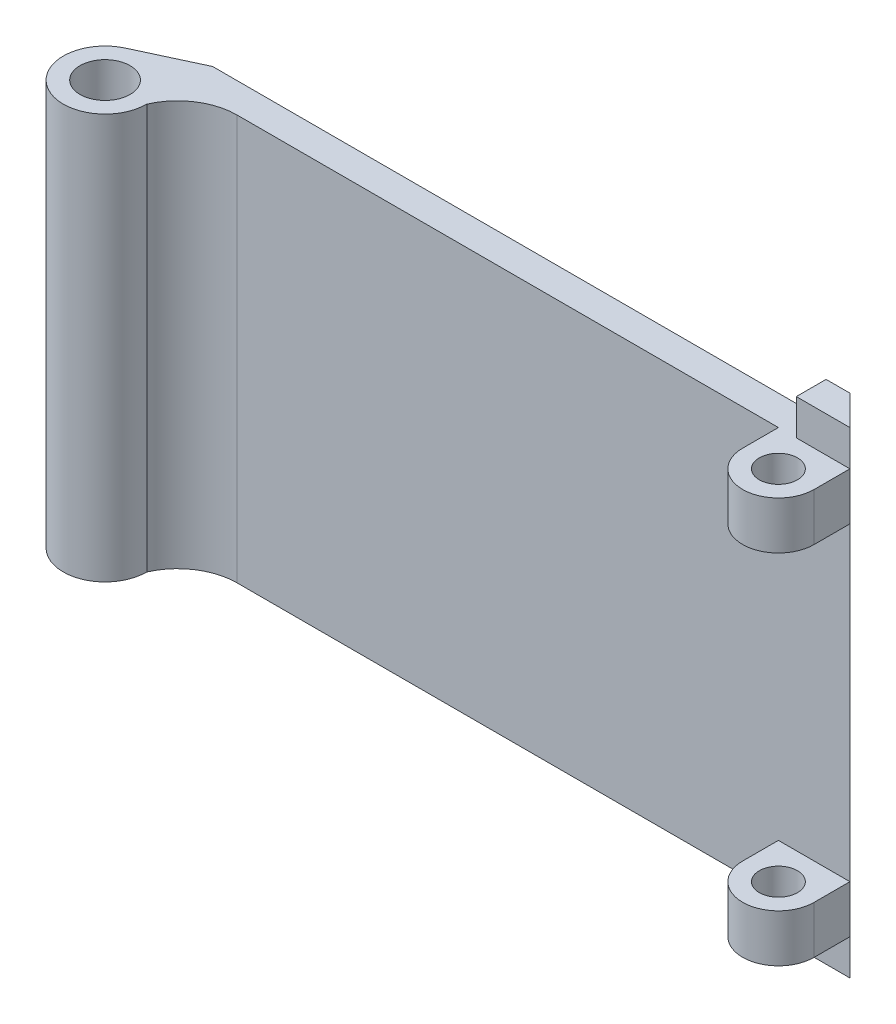
ISO-10303-21;
HEADER;
FILE_DESCRIPTION(('STEP AP214'),'2;1');
FILE_NAME('part.step','',(''),(''),'','','');
FILE_SCHEMA(('AUTOMOTIVE_DESIGN { 1 0 10303 214 1 1 1 1 }'));
ENDSEC;
DATA;
#1=APPLICATION_CONTEXT('core data for automotive mechanical design processes');
#2=APPLICATION_PROTOCOL_DEFINITION('international standard','automotive_design',2000,#1);
#3=PRODUCT_CONTEXT('',#1,'mechanical');
#4=PRODUCT('Part','Part','',(#3));
#5=PRODUCT_RELATED_PRODUCT_CATEGORY('part','',(#4));
#6=PRODUCT_DEFINITION_FORMATION('','',#4);
#7=PRODUCT_DEFINITION_CONTEXT('part definition',#1,'design');
#8=PRODUCT_DEFINITION('design','',#6,#7);
#9=PRODUCT_DEFINITION_SHAPE('','',#8);
#10=(LENGTH_UNIT() NAMED_UNIT(*) SI_UNIT(.MILLI.,.METRE.));
#11=(NAMED_UNIT(*) PLANE_ANGLE_UNIT() SI_UNIT($,.RADIAN.));
#12=(NAMED_UNIT(*) SI_UNIT($,.STERADIAN.) SOLID_ANGLE_UNIT());
#13=UNCERTAINTY_MEASURE_WITH_UNIT(LENGTH_MEASURE(1.E-05),#10,'distance_accuracy_value','');
#14=(GEOMETRIC_REPRESENTATION_CONTEXT(3) GLOBAL_UNCERTAINTY_ASSIGNED_CONTEXT((#13)) GLOBAL_UNIT_ASSIGNED_CONTEXT((#10,
#11,#12)) REPRESENTATION_CONTEXT('',''));
#15=CARTESIAN_POINT('',(0.,0.,0.));
#16=DIRECTION('',(0.,0.,1.));
#17=DIRECTION('',(1.,0.,0.));
#18=AXIS2_PLACEMENT_3D('',#15,#16,#17);
#19=CARTESIAN_POINT('',(0.,0.,2.5));
#20=DIRECTION('',(0.,1.,0.));
#21=DIRECTION('',(-1.,0.,0.));
#22=AXIS2_PLACEMENT_3D('',#19,#20,#21);
#23=PLANE('',#22);
#24=DIRECTION('',(0.906734440104032,0.,-0.421702092867972));
#25=VECTOR('',#24,1.);
#26=CARTESIAN_POINT('',(1.16058560122015,0.,2.49546528962715));
#27=LINE('',#26,#25);
#28=CARTESIAN_POINT('',(1.5240426749621,0.,2.32642945963589));
#29=VERTEX_POINT('',#28);
#30=CARTESIAN_POINT('',(6.52627944162882,0.,0.));
#31=VERTEX_POINT('',#30);
#32=EDGE_CURVE('E184',#29,#31,#27,.T.);
#33=ORIENTED_EDGE('',*,*,#32,.T.);
#34=DIRECTION('',(1.,0.,0.));
#35=VECTOR('',#34,1.);
#36=CARTESIAN_POINT('',(0.,0.,0.));
#37=LINE('',#36,#35);
#38=CARTESIAN_POINT('',(58.,0.,0.));
#39=VERTEX_POINT('',#38);
#40=EDGE_CURVE('E329',#31,#39,#37,.T.);
#41=ORIENTED_EDGE('',*,*,#40,.T.);
#42=DIRECTION('',(0.,0.,-1.));
#43=VECTOR('',#42,1.);
#44=CARTESIAN_POINT('',(58.,0.,0.));
#45=LINE('',#44,#43);
#46=CARTESIAN_POINT('',(58.,0.,2.5));
#47=VERTEX_POINT('',#46);
#48=EDGE_CURVE('E215',#47,#39,#45,.T.);
#49=ORIENTED_EDGE('',*,*,#48,.F.);
#50=DIRECTION('',(-1.,0.,0.));
#51=VECTOR('',#50,1.);
#52=CARTESIAN_POINT('',(58.,0.,2.5));
#53=LINE('',#52,#51);
#54=CARTESIAN_POINT('',(62.5,0.,2.5));
#55=VERTEX_POINT('',#54);
#56=EDGE_CURVE('E226',#55,#47,#53,.T.);
#57=ORIENTED_EDGE('',*,*,#56,.F.);
#58=DIRECTION('',(0.,0.,-1.));
#59=VECTOR('',#58,1.);
#60=CARTESIAN_POINT('',(62.5,0.,0.));
#61=LINE('',#60,#59);
#62=CARTESIAN_POINT('',(62.5,0.,5.5));
#63=VERTEX_POINT('',#62);
#64=EDGE_CURVE('E309',#63,#55,#61,.T.);
#65=ORIENTED_EDGE('',*,*,#64,.F.);
#66=CARTESIAN_POINT('',(59.5,0.,5.5));
#67=DIRECTION('',(0.,-1.,0.));
#68=DIRECTION('',(1.,0.,0.));
#69=AXIS2_PLACEMENT_3D('',#66,#67,#68);
#70=CIRCLE('',#69,3.);
#71=CARTESIAN_POINT('',(56.5,0.,5.5));
#72=VERTEX_POINT('',#71);
#73=EDGE_CURVE('E313',#63,#72,#70,.T.);
#74=ORIENTED_EDGE('',*,*,#73,.T.);
#75=DIRECTION('',(0.,0.,-1.));
#76=VECTOR('',#75,1.);
#77=CARTESIAN_POINT('',(56.5,0.,0.));
#78=LINE('',#77,#76);
#79=CARTESIAN_POINT('',(56.5,0.,2.5));
#80=VERTEX_POINT('',#79);
#81=EDGE_CURVE('E318',#72,#80,#78,.T.);
#82=ORIENTED_EDGE('',*,*,#81,.T.);
#83=DIRECTION('',(1.,0.,0.));
#84=VECTOR('',#83,1.);
#85=CARTESIAN_POINT('',(0.,0.,2.5));
#86=LINE('',#85,#84);
#87=CARTESIAN_POINT('',(11.0825756949558,0.,2.5));
#88=VERTEX_POINT('',#87);
#89=EDGE_CURVE('E375',#88,#80,#86,.T.);
#90=ORIENTED_EDGE('',*,*,#89,.F.);
#91=CARTESIAN_POINT('',(11.0825756949558,0.,7.5));
#92=DIRECTION('',(0.,1.,0.));
#93=DIRECTION('',(-1.,0.,0.));
#94=AXIS2_PLACEMENT_3D('',#91,#92,#93);
#95=CIRCLE('',#94,5.);
#96=CARTESIAN_POINT('',(6.5,0.,5.5));
#97=VERTEX_POINT('',#96);
#98=EDGE_CURVE('E11',#88,#97,#95,.T.);
#99=ORIENTED_EDGE('',*,*,#98,.T.);
#100=CARTESIAN_POINT('',(3.,0.,5.5));
#101=DIRECTION('',(0.,-1.,0.));
#102=DIRECTION('',(1.,0.,0.));
#103=AXIS2_PLACEMENT_3D('',#100,#101,#102);
#104=CIRCLE('',#103,3.5);
#105=EDGE_CURVE('E178',#97,#29,#104,.T.);
#106=ORIENTED_EDGE('',*,*,#105,.T.);
#107=EDGE_LOOP('',(#33,#41,#49,#57,#65,#74,#82,#90,#99,#106));
#108=FACE_BOUND('',#107,.T.);
#109=CARTESIAN_POINT('',(3.,0.,5.5));
#110=DIRECTION('',(0.,-1.,0.));
#111=DIRECTION('',(1.,0.,0.));
#112=AXIS2_PLACEMENT_3D('',#109,#110,#111);
#113=CIRCLE('',#112,2.1);
#114=CARTESIAN_POINT('',(5.1,0.,5.5));
#115=VERTEX_POINT('',#114);
#116=EDGE_CURVE('E205',#115,#115,#113,.T.);
#117=ORIENTED_EDGE('',*,*,#116,.F.);
#118=EDGE_LOOP('',(#117));
#119=FACE_BOUND('',#118,.T.);
#120=CARTESIAN_POINT('',(59.5,0.,5.5));
#121=DIRECTION('',(0.,-1.,0.));
#122=DIRECTION('',(1.,0.,0.));
#123=AXIS2_PLACEMENT_3D('',#120,#121,#122);
#124=CIRCLE('',#123,1.6);
#125=CARTESIAN_POINT('',(61.1,0.,5.5));
#126=VERTEX_POINT('',#125);
#127=EDGE_CURVE('E296',#126,#126,#124,.T.);
#128=ORIENTED_EDGE('',*,*,#127,.F.);
#129=EDGE_LOOP('',(#128));
#130=FACE_BOUND('',#129,.T.);
#131=ADVANCED_FACE('F47',(#108,#119,#130),#23,.F.);
#132=CARTESIAN_POINT('',(0.,34.,2.5));
#133=DIRECTION('',(0.,-1.,0.));
#134=DIRECTION('',(1.,0.,0.));
#135=AXIS2_PLACEMENT_3D('',#132,#133,#134);
#136=PLANE('',#135);
#137=DIRECTION('',(-1.,0.,0.));
#138=VECTOR('',#137,1.);
#139=CARTESIAN_POINT('',(0.,34.,0.));
#140=LINE('',#139,#138);
#141=CARTESIAN_POINT('',(58.,34.,0.));
#142=VERTEX_POINT('',#141);
#143=CARTESIAN_POINT('',(6.52627944162881,34.,0.));
#144=VERTEX_POINT('',#143);
#145=EDGE_CURVE('E379',#142,#144,#140,.T.);
#146=ORIENTED_EDGE('',*,*,#145,.T.);
#147=DIRECTION('',(-0.906734440104032,0.,0.421702092867972));
#148=VECTOR('',#147,1.);
#149=CARTESIAN_POINT('',(1.16058560122014,34.,2.49546528962715));
#150=LINE('',#149,#148);
#151=CARTESIAN_POINT('',(1.52404267496209,34.,2.32642945963589));
#152=VERTEX_POINT('',#151);
#153=EDGE_CURVE('E202',#144,#152,#150,.T.);
#154=ORIENTED_EDGE('',*,*,#153,.T.);
#155=CARTESIAN_POINT('',(3.,34.,5.5));
#156=DIRECTION('',(0.,-1.,0.));
#157=DIRECTION('',(1.,0.,0.));
#158=AXIS2_PLACEMENT_3D('',#155,#156,#157);
#159=CIRCLE('',#158,3.5);
#160=CARTESIAN_POINT('',(6.5,34.,5.5));
#161=VERTEX_POINT('',#160);
#162=EDGE_CURVE('E180',#152,#161,#159,.F.);
#163=ORIENTED_EDGE('',*,*,#162,.T.);
#164=CARTESIAN_POINT('',(11.0825756949558,34.,7.5));
#165=DIRECTION('',(0.,-1.,0.));
#166=DIRECTION('',(1.,0.,0.));
#167=AXIS2_PLACEMENT_3D('',#164,#165,#166);
#168=CIRCLE('',#167,5.);
#169=CARTESIAN_POINT('',(11.0825756949558,34.,2.5));
#170=VERTEX_POINT('',#169);
#171=EDGE_CURVE('E56',#161,#170,#168,.T.);
#172=ORIENTED_EDGE('',*,*,#171,.T.);
#173=DIRECTION('',(-1.,0.,0.));
#174=VECTOR('',#173,1.);
#175=CARTESIAN_POINT('',(0.,34.,2.5));
#176=LINE('',#175,#174);
#177=CARTESIAN_POINT('',(56.5,34.,2.5));
#178=VERTEX_POINT('',#177);
#179=EDGE_CURVE('E378',#178,#170,#176,.T.);
#180=ORIENTED_EDGE('',*,*,#179,.F.);
#181=DIRECTION('',(0.,0.,-1.));
#182=VECTOR('',#181,1.);
#183=CARTESIAN_POINT('',(56.5,34.,0.));
#184=LINE('',#183,#182);
#185=CARTESIAN_POINT('',(56.5,34.,5.5));
#186=VERTEX_POINT('',#185);
#187=EDGE_CURVE('E344',#186,#178,#184,.T.);
#188=ORIENTED_EDGE('',*,*,#187,.F.);
#189=CARTESIAN_POINT('',(59.5,34.,5.5));
#190=DIRECTION('',(0.,-1.,0.));
#191=DIRECTION('',(1.,0.,0.));
#192=AXIS2_PLACEMENT_3D('',#189,#190,#191);
#193=CIRCLE('',#192,3.);
#194=CARTESIAN_POINT('',(62.5,34.,5.5));
#195=VERTEX_POINT('',#194);
#196=EDGE_CURVE('E339',#195,#186,#193,.T.);
#197=ORIENTED_EDGE('',*,*,#196,.F.);
#198=DIRECTION('',(0.,0.,-1.));
#199=VECTOR('',#198,1.);
#200=CARTESIAN_POINT('',(62.5,34.,0.));
#201=LINE('',#200,#199);
#202=CARTESIAN_POINT('',(62.5,34.,2.5));
#203=VERTEX_POINT('',#202);
#204=EDGE_CURVE('E335',#195,#203,#201,.T.);
#205=ORIENTED_EDGE('',*,*,#204,.T.);
#206=DIRECTION('',(-1.,0.,0.));
#207=VECTOR('',#206,1.);
#208=CARTESIAN_POINT('',(62.5,34.,2.5));
#209=LINE('',#208,#207);
#210=CARTESIAN_POINT('',(58.,34.,2.5));
#211=VERTEX_POINT('',#210);
#212=EDGE_CURVE('E244',#203,#211,#209,.T.);
#213=ORIENTED_EDGE('',*,*,#212,.T.);
#214=DIRECTION('',(0.,0.,-1.));
#215=VECTOR('',#214,1.);
#216=CARTESIAN_POINT('',(58.,34.,2.5));
#217=LINE('',#216,#215);
#218=EDGE_CURVE('E250',#211,#142,#217,.T.);
#219=ORIENTED_EDGE('',*,*,#218,.T.);
#220=EDGE_LOOP('',(#146,#154,#163,#172,#180,#188,#197,#205,#213,#219));
#221=FACE_BOUND('',#220,.T.);
#222=CARTESIAN_POINT('',(3.,34.,5.5));
#223=DIRECTION('',(0.,-1.,0.));
#224=DIRECTION('',(1.,0.,0.));
#225=AXIS2_PLACEMENT_3D('',#222,#223,#224);
#226=CIRCLE('',#225,2.1);
#227=CARTESIAN_POINT('',(5.1,34.,5.5));
#228=VERTEX_POINT('',#227);
#229=EDGE_CURVE('E209',#228,#228,#226,.T.);
#230=ORIENTED_EDGE('',*,*,#229,.T.);
#231=EDGE_LOOP('',(#230));
#232=FACE_BOUND('',#231,.T.);
#233=CARTESIAN_POINT('',(59.5,34.,5.5));
#234=DIRECTION('',(0.,-1.,0.));
#235=DIRECTION('',(1.,0.,0.));
#236=AXIS2_PLACEMENT_3D('',#233,#234,#235);
#237=CIRCLE('',#236,1.6);
#238=CARTESIAN_POINT('',(61.1,34.,5.5));
#239=VERTEX_POINT('',#238);
#240=EDGE_CURVE('E348',#239,#239,#237,.T.);
#241=ORIENTED_EDGE('',*,*,#240,.T.);
#242=EDGE_LOOP('',(#241));
#243=FACE_BOUND('',#242,.T.);
#244=ADVANCED_FACE('F404',(#221,#232,#243),#136,.F.);
#245=CARTESIAN_POINT('',(0.,0.,0.));
#246=DIRECTION('',(0.,0.,1.));
#247=DIRECTION('',(1.,0.,0.));
#248=AXIS2_PLACEMENT_3D('',#245,#246,#247);
#249=PLANE('',#248);
#250=DIRECTION('',(0.,1.,0.));
#251=VECTOR('',#250,1.);
#252=CARTESIAN_POINT('',(60.,0.,0.));
#253=LINE('',#252,#251);
#254=CARTESIAN_POINT('',(60.,-3.,0.));
#255=VERTEX_POINT('',#254);
#256=CARTESIAN_POINT('',(60.,37.,0.));
#257=VERTEX_POINT('',#256);
#258=EDGE_CURVE('E278',#255,#257,#253,.T.);
#259=ORIENTED_EDGE('',*,*,#258,.F.);
#260=DIRECTION('',(1.,0.,0.));
#261=VECTOR('',#260,1.);
#262=CARTESIAN_POINT('',(60.,-3.,0.));
#263=LINE('',#262,#261);
#264=CARTESIAN_POINT('',(58.,-3.,0.));
#265=VERTEX_POINT('',#264);
#266=EDGE_CURVE('E218',#265,#255,#263,.T.);
#267=ORIENTED_EDGE('',*,*,#266,.F.);
#268=DIRECTION('',(0.,1.,0.));
#269=VECTOR('',#268,1.);
#270=CARTESIAN_POINT('',(58.,-3.,0.));
#271=LINE('',#270,#269);
#272=EDGE_CURVE('E236',#265,#39,#271,.T.);
#273=ORIENTED_EDGE('',*,*,#272,.T.);
#274=ORIENTED_EDGE('',*,*,#40,.F.);
#275=DIRECTION('',(0.,1.,0.));
#276=VECTOR('',#275,1.);
#277=CARTESIAN_POINT('',(6.52627944162882,0.,0.));
#278=LINE('',#277,#276);
#279=EDGE_CURVE('E189',#31,#144,#278,.T.);
#280=ORIENTED_EDGE('',*,*,#279,.T.);
#281=ORIENTED_EDGE('',*,*,#145,.F.);
#282=DIRECTION('',(0.,-1.,0.));
#283=VECTOR('',#282,1.);
#284=CARTESIAN_POINT('',(58.,37.,0.));
#285=LINE('',#284,#283);
#286=CARTESIAN_POINT('',(58.,37.,0.));
#287=VERTEX_POINT('',#286);
#288=EDGE_CURVE('E269',#287,#142,#285,.T.);
#289=ORIENTED_EDGE('',*,*,#288,.F.);
#290=DIRECTION('',(1.,0.,0.));
#291=VECTOR('',#290,1.);
#292=CARTESIAN_POINT('',(58.,37.,0.));
#293=LINE('',#292,#291);
#294=EDGE_CURVE('E258',#287,#257,#293,.T.);
#295=ORIENTED_EDGE('',*,*,#294,.T.);
#296=EDGE_LOOP('',(#259,#267,#273,#274,#280,#281,#289,#295));
#297=FACE_BOUND('',#296,.T.);
#298=ADVANCED_FACE('F417',(#297),#249,.F.);
#299=CARTESIAN_POINT('',(62.5,4.,0.));
#300=DIRECTION('',(-1.,0.,0.));
#301=DIRECTION('',(0.,-1.,0.));
#302=AXIS2_PLACEMENT_3D('',#299,#300,#301);
#303=PLANE('',#302);
#304=DIRECTION('',(0.,-1.,0.));
#305=VECTOR('',#304,1.);
#306=CARTESIAN_POINT('',(62.5,4.,2.49999999999999));
#307=LINE('',#306,#305);
#308=CARTESIAN_POINT('',(62.5,30.,2.5));
#309=VERTEX_POINT('',#308);
#310=EDGE_CURVE('E395',#203,#309,#307,.T.);
#311=ORIENTED_EDGE('',*,*,#310,.F.);
#312=ORIENTED_EDGE('',*,*,#204,.F.);
#313=DIRECTION('',(0.,-1.,0.));
#314=VECTOR('',#313,1.);
#315=CARTESIAN_POINT('',(62.5,34.,5.5));
#316=LINE('',#315,#314);
#317=CARTESIAN_POINT('',(62.5,30.,5.5));
#318=VERTEX_POINT('',#317);
#319=EDGE_CURVE('E352',#195,#318,#316,.T.);
#320=ORIENTED_EDGE('',*,*,#319,.T.);
#321=DIRECTION('',(0.,0.,-1.));
#322=VECTOR('',#321,1.);
#323=CARTESIAN_POINT('',(62.5,30.,0.));
#324=LINE('',#323,#322);
#325=EDGE_CURVE('E290',#318,#309,#324,.T.);
#326=ORIENTED_EDGE('',*,*,#325,.T.);
#327=EDGE_LOOP('',(#311,#312,#320,#326));
#328=FACE_BOUND('',#327,.T.);
#329=ADVANCED_FACE('F422',(#328),#303,.F.);
#330=DIRECTION('',(0.,1.,0.));
#331=VECTOR('',#330,1.);
#332=CARTESIAN_POINT('',(62.5,0.,2.5));
#333=LINE('',#332,#331);
#334=CARTESIAN_POINT('',(62.5,4.,2.5));
#335=VERTEX_POINT('',#334);
#336=EDGE_CURVE('E272',#55,#335,#333,.T.);
#337=ORIENTED_EDGE('',*,*,#336,.T.);
#338=DIRECTION('',(0.,0.,-1.));
#339=VECTOR('',#338,1.);
#340=CARTESIAN_POINT('',(62.5,4.,0.));
#341=LINE('',#340,#339);
#342=CARTESIAN_POINT('',(62.5,4.,5.5));
#343=VERTEX_POINT('',#342);
#344=EDGE_CURVE('E291',#343,#335,#341,.T.);
#345=ORIENTED_EDGE('',*,*,#344,.F.);
#346=DIRECTION('',(0.,-1.,0.));
#347=VECTOR('',#346,1.);
#348=CARTESIAN_POINT('',(62.5,4.,5.5));
#349=LINE('',#348,#347);
#350=EDGE_CURVE('E308',#343,#63,#349,.T.);
#351=ORIENTED_EDGE('',*,*,#350,.T.);
#352=ORIENTED_EDGE('',*,*,#64,.T.);
#353=EDGE_LOOP('',(#337,#345,#351,#352));
#354=FACE_BOUND('',#353,.T.);
#355=ADVANCED_FACE('F428',(#354),#303,.F.);
#356=CARTESIAN_POINT('',(0.,0.,2.5));
#357=DIRECTION('',(0.,0.,1.));
#358=DIRECTION('',(1.,0.,0.));
#359=AXIS2_PLACEMENT_3D('',#356,#357,#358);
#360=PLANE('',#359);
#361=ORIENTED_EDGE('',*,*,#179,.T.);
#362=DIRECTION('',(0.,1.,0.));
#363=VECTOR('',#362,1.);
#364=CARTESIAN_POINT('',(11.0825756949558,0.,2.5));
#365=LINE('',#364,#363);
#366=EDGE_CURVE('E63',#170,#88,#365,.F.);
#367=ORIENTED_EDGE('',*,*,#366,.T.);
#368=ORIENTED_EDGE('',*,*,#89,.T.);
#369=DIRECTION('',(0.,-1.,0.));
#370=VECTOR('',#369,1.);
#371=CARTESIAN_POINT('',(56.5,4.,2.5));
#372=LINE('',#371,#370);
#373=CARTESIAN_POINT('',(56.5,4.,2.5));
#374=VERTEX_POINT('',#373);
#375=EDGE_CURVE('E325',#374,#80,#372,.T.);
#376=ORIENTED_EDGE('',*,*,#375,.F.);
#377=DIRECTION('',(1.,0.,0.));
#378=VECTOR('',#377,1.);
#379=CARTESIAN_POINT('',(0.,4.,2.5));
#380=LINE('',#379,#378);
#381=EDGE_CURVE('E391',#374,#335,#380,.T.);
#382=ORIENTED_EDGE('',*,*,#381,.T.);
#383=DIRECTION('',(0.,1.,0.));
#384=VECTOR('',#383,1.);
#385=CARTESIAN_POINT('',(62.5,-2.91547594742265,2.5));
#386=LINE('',#385,#384);
#387=EDGE_CURVE('E281',#335,#309,#386,.T.);
#388=ORIENTED_EDGE('',*,*,#387,.T.);
#389=DIRECTION('',(1.,0.,0.));
#390=VECTOR('',#389,1.);
#391=CARTESIAN_POINT('',(0.,30.,2.5));
#392=LINE('',#391,#390);
#393=CARTESIAN_POINT('',(56.5,30.,2.5));
#394=VERTEX_POINT('',#393);
#395=EDGE_CURVE('E382',#394,#309,#392,.T.);
#396=ORIENTED_EDGE('',*,*,#395,.F.);
#397=DIRECTION('',(0.,-1.,0.));
#398=VECTOR('',#397,1.);
#399=CARTESIAN_POINT('',(56.5,34.,2.5));
#400=LINE('',#399,#398);
#401=EDGE_CURVE('E314',#178,#394,#400,.T.);
#402=ORIENTED_EDGE('',*,*,#401,.F.);
#403=EDGE_LOOP('',(#361,#367,#368,#376,#382,#388,#396,#402));
#404=FACE_BOUND('',#403,.T.);
#405=ADVANCED_FACE('F424',(#404),#360,.T.);
#406=CARTESIAN_POINT('',(56.5,34.,0.));
#407=DIRECTION('',(-1.,0.,0.));
#408=DIRECTION('',(0.,-1.,0.));
#409=AXIS2_PLACEMENT_3D('',#406,#407,#408);
#410=PLANE('',#409);
#411=DIRECTION('',(0.,0.,-1.));
#412=VECTOR('',#411,1.);
#413=CARTESIAN_POINT('',(56.5,30.,0.));
#414=LINE('',#413,#412);
#415=CARTESIAN_POINT('',(56.5,30.,5.5));
#416=VERTEX_POINT('',#415);
#417=EDGE_CURVE('E360',#416,#394,#414,.T.);
#418=ORIENTED_EDGE('',*,*,#417,.F.);
#419=DIRECTION('',(0.,-1.,0.));
#420=VECTOR('',#419,1.);
#421=CARTESIAN_POINT('',(56.5,34.,5.5));
#422=LINE('',#421,#420);
#423=EDGE_CURVE('E370',#186,#416,#422,.T.);
#424=ORIENTED_EDGE('',*,*,#423,.F.);
#425=ORIENTED_EDGE('',*,*,#187,.T.);
#426=ORIENTED_EDGE('',*,*,#401,.T.);
#427=EDGE_LOOP('',(#418,#424,#425,#426));
#428=FACE_BOUND('',#427,.T.);
#429=ADVANCED_FACE('F427',(#428),#410,.T.);
#430=CARTESIAN_POINT('',(59.5,34.,5.5));
#431=DIRECTION('',(0.,-1.,0.));
#432=DIRECTION('',(1.,0.,0.));
#433=AXIS2_PLACEMENT_3D('',#430,#431,#432);
#434=CYLINDRICAL_SURFACE('',#433,3.);
#435=CARTESIAN_POINT('',(59.5,30.,5.5));
#436=DIRECTION('',(0.,-1.,0.));
#437=DIRECTION('',(1.,0.,0.));
#438=AXIS2_PLACEMENT_3D('',#435,#436,#437);
#439=CIRCLE('',#438,3.);
#440=EDGE_CURVE('E356',#318,#416,#439,.T.);
#441=ORIENTED_EDGE('',*,*,#440,.F.);
#442=ORIENTED_EDGE('',*,*,#319,.F.);
#443=ORIENTED_EDGE('',*,*,#196,.T.);
#444=ORIENTED_EDGE('',*,*,#423,.T.);
#445=EDGE_LOOP('',(#441,#442,#443,#444));
#446=FACE_BOUND('',#445,.T.);
#447=ADVANCED_FACE('F429',(#446),#434,.T.);
#448=CARTESIAN_POINT('',(59.5,34.,5.5));
#449=DIRECTION('',(0.,-1.,0.));
#450=DIRECTION('',(1.,0.,0.));
#451=AXIS2_PLACEMENT_3D('',#448,#449,#450);
#452=CYLINDRICAL_SURFACE('',#451,1.6);
#453=ORIENTED_EDGE('',*,*,#240,.F.);
#454=EDGE_LOOP('',(#453));
#455=FACE_BOUND('',#454,.T.);
#456=CARTESIAN_POINT('',(59.5,30.,5.5));
#457=DIRECTION('',(0.,-1.,0.));
#458=DIRECTION('',(1.,0.,0.));
#459=AXIS2_PLACEMENT_3D('',#456,#457,#458);
#460=CIRCLE('',#459,1.6);
#461=CARTESIAN_POINT('',(61.1,30.,5.5));
#462=VERTEX_POINT('',#461);
#463=EDGE_CURVE('E340',#462,#462,#460,.T.);
#464=ORIENTED_EDGE('',*,*,#463,.T.);
#465=EDGE_LOOP('',(#464));
#466=FACE_BOUND('',#465,.T.);
#467=ADVANCED_FACE('F432',(#455,#466),#452,.F.);
#468=CARTESIAN_POINT('',(56.5,30.,0.));
#469=DIRECTION('',(0.,-1.,0.));
#470=DIRECTION('',(1.,0.,0.));
#471=AXIS2_PLACEMENT_3D('',#468,#469,#470);
#472=PLANE('',#471);
#473=ORIENTED_EDGE('',*,*,#325,.F.);
#474=ORIENTED_EDGE('',*,*,#440,.T.);
#475=ORIENTED_EDGE('',*,*,#417,.T.);
#476=ORIENTED_EDGE('',*,*,#395,.T.);
#477=EDGE_LOOP('',(#473,#474,#475,#476));
#478=FACE_BOUND('',#477,.T.);
#479=ORIENTED_EDGE('',*,*,#463,.F.);
#480=EDGE_LOOP('',(#479));
#481=FACE_BOUND('',#480,.T.);
#482=ADVANCED_FACE('F439',(#478,#481),#472,.T.);
#483=CARTESIAN_POINT('',(56.5,4.,0.));
#484=DIRECTION('',(-1.,0.,0.));
#485=DIRECTION('',(0.,-1.,0.));
#486=AXIS2_PLACEMENT_3D('',#483,#484,#485);
#487=PLANE('',#486);
#488=ORIENTED_EDGE('',*,*,#81,.F.);
#489=DIRECTION('',(0.,-1.,0.));
#490=VECTOR('',#489,1.);
#491=CARTESIAN_POINT('',(56.5,4.,5.5));
#492=LINE('',#491,#490);
#493=CARTESIAN_POINT('',(56.5,4.,5.5));
#494=VERTEX_POINT('',#493);
#495=EDGE_CURVE('E330',#494,#72,#492,.T.);
#496=ORIENTED_EDGE('',*,*,#495,.F.);
#497=DIRECTION('',(0.,0.,-1.));
#498=VECTOR('',#497,1.);
#499=CARTESIAN_POINT('',(56.5,4.,0.));
#500=LINE('',#499,#498);
#501=EDGE_CURVE('E300',#494,#374,#500,.T.);
#502=ORIENTED_EDGE('',*,*,#501,.T.);
#503=ORIENTED_EDGE('',*,*,#375,.T.);
#504=EDGE_LOOP('',(#488,#496,#502,#503));
#505=FACE_BOUND('',#504,.T.);
#506=ADVANCED_FACE('F443',(#505),#487,.T.);
#507=CARTESIAN_POINT('',(59.5,4.,5.5));
#508=DIRECTION('',(0.,-1.,0.));
#509=DIRECTION('',(1.,0.,0.));
#510=AXIS2_PLACEMENT_3D('',#507,#508,#509);
#511=CYLINDRICAL_SURFACE('',#510,3.);
#512=ORIENTED_EDGE('',*,*,#73,.F.);
#513=ORIENTED_EDGE('',*,*,#350,.F.);
#514=CARTESIAN_POINT('',(59.5,4.,5.5));
#515=DIRECTION('',(0.,-1.,0.));
#516=DIRECTION('',(1.,0.,0.));
#517=AXIS2_PLACEMENT_3D('',#514,#515,#516);
#518=CIRCLE('',#517,3.);
#519=EDGE_CURVE('E295',#343,#494,#518,.T.);
#520=ORIENTED_EDGE('',*,*,#519,.T.);
#521=ORIENTED_EDGE('',*,*,#495,.T.);
#522=EDGE_LOOP('',(#512,#513,#520,#521));
#523=FACE_BOUND('',#522,.T.);
#524=ADVANCED_FACE('F448',(#523),#511,.T.);
#525=CARTESIAN_POINT('',(59.5,4.,5.5));
#526=DIRECTION('',(0.,-1.,0.));
#527=DIRECTION('',(1.,0.,0.));
#528=AXIS2_PLACEMENT_3D('',#525,#526,#527);
#529=CYLINDRICAL_SURFACE('',#528,1.6);
#530=CARTESIAN_POINT('',(59.5,4.,5.5));
#531=DIRECTION('',(0.,-1.,0.));
#532=DIRECTION('',(1.,0.,0.));
#533=AXIS2_PLACEMENT_3D('',#530,#531,#532);
#534=CIRCLE('',#533,1.6);
#535=CARTESIAN_POINT('',(61.1,4.,5.5));
#536=VERTEX_POINT('',#535);
#537=EDGE_CURVE('E304',#536,#536,#534,.T.);
#538=ORIENTED_EDGE('',*,*,#537,.F.);
#539=EDGE_LOOP('',(#538));
#540=FACE_BOUND('',#539,.T.);
#541=ORIENTED_EDGE('',*,*,#127,.T.);
#542=EDGE_LOOP('',(#541));
#543=FACE_BOUND('',#542,.T.);
#544=ADVANCED_FACE('F451',(#540,#543),#529,.F.);
#545=CARTESIAN_POINT('',(56.5,4.,0.));
#546=DIRECTION('',(0.,-1.,0.));
#547=DIRECTION('',(1.,0.,0.));
#548=AXIS2_PLACEMENT_3D('',#545,#546,#547);
#549=PLANE('',#548);
#550=ORIENTED_EDGE('',*,*,#344,.T.);
#551=ORIENTED_EDGE('',*,*,#381,.F.);
#552=ORIENTED_EDGE('',*,*,#501,.F.);
#553=ORIENTED_EDGE('',*,*,#519,.F.);
#554=EDGE_LOOP('',(#550,#551,#552,#553));
#555=FACE_BOUND('',#554,.T.);
#556=ORIENTED_EDGE('',*,*,#537,.T.);
#557=EDGE_LOOP('',(#556));
#558=FACE_BOUND('',#557,.T.);
#559=ADVANCED_FACE('F458',(#555,#558),#549,.F.);
#560=CARTESIAN_POINT('',(29.9999999999996,0.,-30.));
#561=DIRECTION('',(0.707106781186543,0.,-0.707106781186552));
#562=DIRECTION('',(-0.707106781186552,0.,-0.707106781186543));
#563=AXIS2_PLACEMENT_3D('',#560,#561,#562);
#564=PLANE('',#563);
#565=ORIENTED_EDGE('',*,*,#258,.T.);
#566=DIRECTION('',(0.707106781186551,0.,0.707106781186544));
#567=VECTOR('',#566,1.);
#568=CARTESIAN_POINT('',(60.,37.,0.));
#569=LINE('',#568,#567);
#570=CARTESIAN_POINT('',(62.5,37.,2.5));
#571=VERTEX_POINT('',#570);
#572=EDGE_CURVE('E245',#257,#571,#569,.T.);
#573=ORIENTED_EDGE('',*,*,#572,.T.);
#574=DIRECTION('',(0.,-1.,0.));
#575=VECTOR('',#574,1.);
#576=CARTESIAN_POINT('',(62.5,37.,2.5));
#577=LINE('',#576,#575);
#578=EDGE_CURVE('E262',#571,#203,#577,.T.);
#579=ORIENTED_EDGE('',*,*,#578,.T.);
#580=ORIENTED_EDGE('',*,*,#310,.T.);
#581=ORIENTED_EDGE('',*,*,#387,.F.);
#582=ORIENTED_EDGE('',*,*,#336,.F.);
#583=DIRECTION('',(0.,1.,0.));
#584=VECTOR('',#583,1.);
#585=CARTESIAN_POINT('',(62.5,-3.,2.5));
#586=LINE('',#585,#584);
#587=CARTESIAN_POINT('',(62.5,-3.,2.5));
#588=VERTEX_POINT('',#587);
#589=EDGE_CURVE('E225',#588,#55,#586,.T.);
#590=ORIENTED_EDGE('',*,*,#589,.F.);
#591=DIRECTION('',(0.707106781186551,0.,0.707106781186544));
#592=VECTOR('',#591,1.);
#593=CARTESIAN_POINT('',(62.5,-3.,2.5));
#594=LINE('',#593,#592);
#595=EDGE_CURVE('E222',#255,#588,#594,.T.);
#596=ORIENTED_EDGE('',*,*,#595,.F.);
#597=EDGE_LOOP('',(#565,#573,#579,#580,#581,#582,#590,#596));
#598=FACE_BOUND('',#597,.T.);
#599=ADVANCED_FACE('F462',(#598),#564,.T.);
#600=CARTESIAN_POINT('',(58.,37.,2.5));
#601=DIRECTION('',(-1.,0.,0.));
#602=DIRECTION('',(0.,-1.,0.));
#603=AXIS2_PLACEMENT_3D('',#600,#601,#602);
#604=PLANE('',#603);
#605=ORIENTED_EDGE('',*,*,#218,.F.);
#606=DIRECTION('',(0.,-1.,0.));
#607=VECTOR('',#606,1.);
#608=CARTESIAN_POINT('',(58.,37.,2.5));
#609=LINE('',#608,#607);
#610=CARTESIAN_POINT('',(58.,37.,2.5));
#611=VERTEX_POINT('',#610);
#612=EDGE_CURVE('E273',#611,#211,#609,.T.);
#613=ORIENTED_EDGE('',*,*,#612,.F.);
#614=DIRECTION('',(0.,0.,-1.));
#615=VECTOR('',#614,1.);
#616=CARTESIAN_POINT('',(58.,37.,2.5));
#617=LINE('',#616,#615);
#618=EDGE_CURVE('E254',#611,#287,#617,.T.);
#619=ORIENTED_EDGE('',*,*,#618,.T.);
#620=ORIENTED_EDGE('',*,*,#288,.T.);
#621=EDGE_LOOP('',(#605,#613,#619,#620));
#622=FACE_BOUND('',#621,.T.);
#623=ADVANCED_FACE('F466',(#622),#604,.T.);
#624=CARTESIAN_POINT('',(62.5,37.,2.5));
#625=DIRECTION('',(0.,0.,1.));
#626=DIRECTION('',(1.,0.,0.));
#627=AXIS2_PLACEMENT_3D('',#624,#625,#626);
#628=PLANE('',#627);
#629=ORIENTED_EDGE('',*,*,#212,.F.);
#630=ORIENTED_EDGE('',*,*,#578,.F.);
#631=DIRECTION('',(-1.,0.,0.));
#632=VECTOR('',#631,1.);
#633=CARTESIAN_POINT('',(62.5,37.,2.5));
#634=LINE('',#633,#632);
#635=EDGE_CURVE('E249',#571,#611,#634,.T.);
#636=ORIENTED_EDGE('',*,*,#635,.T.);
#637=ORIENTED_EDGE('',*,*,#612,.T.);
#638=EDGE_LOOP('',(#629,#630,#636,#637));
#639=FACE_BOUND('',#638,.T.);
#640=ADVANCED_FACE('F468',(#639),#628,.T.);
#641=CARTESIAN_POINT('',(0.,37.,0.));
#642=DIRECTION('',(0.,-1.,0.));
#643=DIRECTION('',(0.,0.,-1.));
#644=AXIS2_PLACEMENT_3D('',#641,#642,#643);
#645=PLANE('',#644);
#646=ORIENTED_EDGE('',*,*,#572,.F.);
#647=ORIENTED_EDGE('',*,*,#294,.F.);
#648=ORIENTED_EDGE('',*,*,#618,.F.);
#649=ORIENTED_EDGE('',*,*,#635,.F.);
#650=EDGE_LOOP('',(#646,#647,#648,#649));
#651=FACE_BOUND('',#650,.T.);
#652=ADVANCED_FACE('F471',(#651),#645,.F.);
#653=CARTESIAN_POINT('',(58.,-3.,2.5));
#654=DIRECTION('',(0.,0.,-1.));
#655=DIRECTION('',(-1.,0.,0.));
#656=AXIS2_PLACEMENT_3D('',#653,#654,#655);
#657=PLANE('',#656);
#658=ORIENTED_EDGE('',*,*,#56,.T.);
#659=DIRECTION('',(0.,1.,0.));
#660=VECTOR('',#659,1.);
#661=CARTESIAN_POINT('',(58.,-3.,2.5));
#662=LINE('',#661,#660);
#663=CARTESIAN_POINT('',(58.,-3.,2.5));
#664=VERTEX_POINT('',#663);
#665=EDGE_CURVE('E240',#664,#47,#662,.T.);
#666=ORIENTED_EDGE('',*,*,#665,.F.);
#667=DIRECTION('',(-1.,0.,0.));
#668=VECTOR('',#667,1.);
#669=CARTESIAN_POINT('',(58.,-3.,2.5));
#670=LINE('',#669,#668);
#671=EDGE_CURVE('E210',#588,#664,#670,.T.);
#672=ORIENTED_EDGE('',*,*,#671,.F.);
#673=ORIENTED_EDGE('',*,*,#589,.T.);
#674=EDGE_LOOP('',(#658,#666,#672,#673));
#675=FACE_BOUND('',#674,.T.);
#676=ADVANCED_FACE('F478',(#675),#657,.F.);
#677=CARTESIAN_POINT('',(58.,-3.,0.));
#678=DIRECTION('',(1.,0.,0.));
#679=DIRECTION('',(0.,1.,0.));
#680=AXIS2_PLACEMENT_3D('',#677,#678,#679);
#681=PLANE('',#680);
#682=ORIENTED_EDGE('',*,*,#48,.T.);
#683=ORIENTED_EDGE('',*,*,#272,.F.);
#684=DIRECTION('',(0.,0.,-1.));
#685=VECTOR('',#684,1.);
#686=CARTESIAN_POINT('',(58.,-3.,0.));
#687=LINE('',#686,#685);
#688=EDGE_CURVE('E214',#664,#265,#687,.T.);
#689=ORIENTED_EDGE('',*,*,#688,.F.);
#690=ORIENTED_EDGE('',*,*,#665,.T.);
#691=EDGE_LOOP('',(#682,#683,#689,#690));
#692=FACE_BOUND('',#691,.T.);
#693=ADVANCED_FACE('F482',(#692),#681,.F.);
#694=CARTESIAN_POINT('',(0.,-3.,0.));
#695=DIRECTION('',(0.,-1.,0.));
#696=DIRECTION('',(1.,0.,0.));
#697=AXIS2_PLACEMENT_3D('',#694,#695,#696);
#698=PLANE('',#697);
#699=ORIENTED_EDGE('',*,*,#671,.T.);
#700=ORIENTED_EDGE('',*,*,#688,.T.);
#701=ORIENTED_EDGE('',*,*,#266,.T.);
#702=ORIENTED_EDGE('',*,*,#595,.T.);
#703=EDGE_LOOP('',(#699,#700,#701,#702));
#704=FACE_BOUND('',#703,.T.);
#705=ADVANCED_FACE('F486',(#704),#698,.T.);
#706=CARTESIAN_POINT('',(3.,37.,5.5));
#707=DIRECTION('',(0.,-1.,0.));
#708=DIRECTION('',(1.,0.,0.));
#709=AXIS2_PLACEMENT_3D('',#706,#707,#708);
#710=CYLINDRICAL_SURFACE('',#709,2.1);
#711=ORIENTED_EDGE('',*,*,#116,.T.);
#712=EDGE_LOOP('',(#711));
#713=FACE_BOUND('',#712,.T.);
#714=ORIENTED_EDGE('',*,*,#229,.F.);
#715=EDGE_LOOP('',(#714));
#716=FACE_BOUND('',#715,.T.);
#717=ADVANCED_FACE('F490',(#713,#716),#710,.F.);
#718=CARTESIAN_POINT('',(3.,45.8419070302689,5.5));
#719=DIRECTION('',(0.,-1.,0.));
#720=DIRECTION('',(1.,0.,0.));
#721=AXIS2_PLACEMENT_3D('',#718,#719,#720);
#722=CYLINDRICAL_SURFACE('',#721,3.5);
#723=ORIENTED_EDGE('',*,*,#162,.F.);
#724=DIRECTION('',(0.,-1.,0.));
#725=VECTOR('',#724,1.);
#726=CARTESIAN_POINT('',(1.52404267496209,45.8419070302689,2.32642945963589));
#727=LINE('',#726,#725);
#728=EDGE_CURVE('E173',#152,#29,#727,.T.);
#729=ORIENTED_EDGE('',*,*,#728,.T.);
#730=ORIENTED_EDGE('',*,*,#105,.F.);
#731=DIRECTION('',(0.,-1.,0.));
#732=VECTOR('',#731,1.);
#733=CARTESIAN_POINT('',(6.5,45.8419070302689,5.5));
#734=LINE('',#733,#732);
#735=EDGE_CURVE('E183',#161,#97,#734,.T.);
#736=ORIENTED_EDGE('',*,*,#735,.F.);
#737=EDGE_LOOP('',(#723,#729,#730,#736));
#738=FACE_BOUND('',#737,.T.);
#739=ADVANCED_FACE('F175',(#738),#722,.T.);
#740=CARTESIAN_POINT('',(1.16058560122014,45.8419070302689,2.49546528962715));
#741=DIRECTION('',(-0.421702092867972,0.,-0.906734440104032));
#742=DIRECTION('',(-0.906734440104032,0.,0.421702092867972));
#743=AXIS2_PLACEMENT_3D('',#740,#741,#742);
#744=PLANE('',#743);
#745=ORIENTED_EDGE('',*,*,#153,.F.);
#746=ORIENTED_EDGE('',*,*,#279,.F.);
#747=ORIENTED_EDGE('',*,*,#32,.F.);
#748=ORIENTED_EDGE('',*,*,#728,.F.);
#749=EDGE_LOOP('',(#745,#746,#747,#748));
#750=FACE_BOUND('',#749,.T.);
#751=ADVANCED_FACE('F187',(#750),#744,.T.);
#752=CARTESIAN_POINT('',(11.0825756949558,45.8419070302689,7.5));
#753=DIRECTION('',(0.,-1.,0.));
#754=DIRECTION('',(1.,0.,0.));
#755=AXIS2_PLACEMENT_3D('',#752,#753,#754);
#756=CYLINDRICAL_SURFACE('',#755,5.);
#757=ORIENTED_EDGE('',*,*,#98,.F.);
#758=ORIENTED_EDGE('',*,*,#366,.F.);
#759=ORIENTED_EDGE('',*,*,#171,.F.);
#760=ORIENTED_EDGE('',*,*,#735,.T.);
#761=EDGE_LOOP('',(#757,#758,#759,#760));
#762=FACE_BOUND('',#761,.T.);
#763=ADVANCED_FACE('F49',(#762),#756,.F.);
#764=CLOSED_SHELL('',(#131,#244,#298,#329,#355,#405,#429,#447,#467,#482,#506,#524,#544,#559,
#599,#623,#640,#652,#676,#693,#705,#717,#739,#751,#763));
#765=MANIFOLD_SOLID_BREP('B2',#764);
#766=ADVANCED_BREP_SHAPE_REPRESENTATION('',(#18,#765),#14);
#767=SHAPE_DEFINITION_REPRESENTATION(#9,#766);
ENDSEC;
END-ISO-10303-21;
